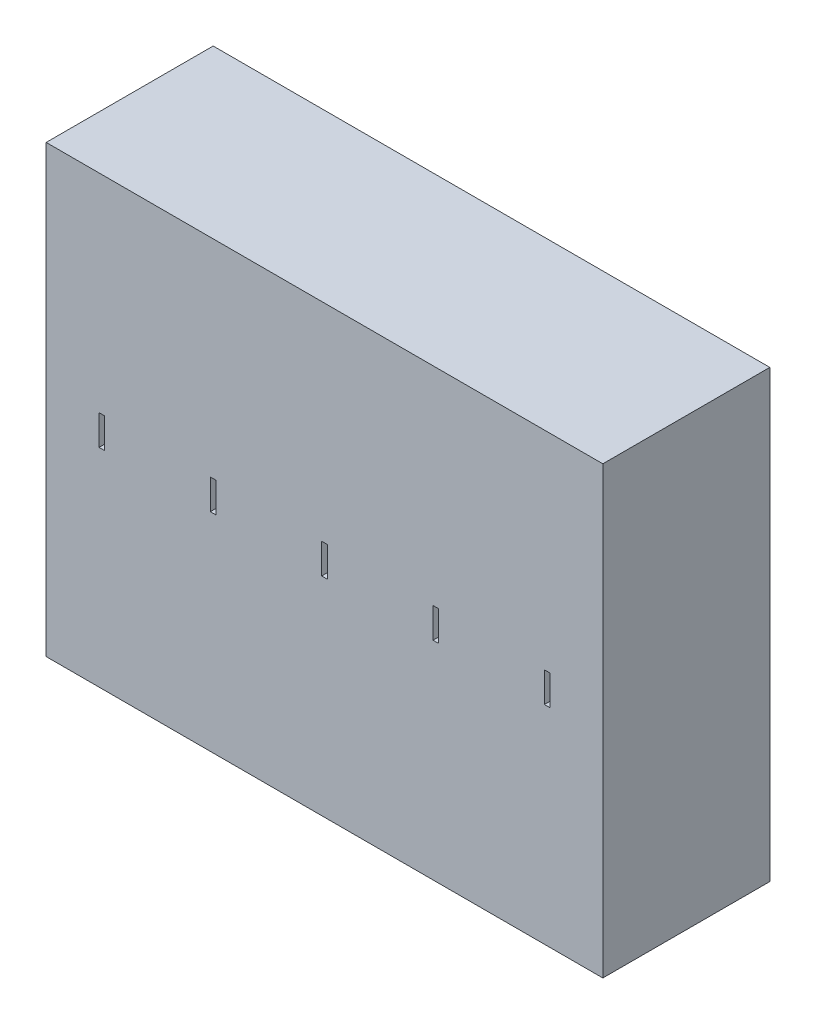
ISO-10303-21;
HEADER;
FILE_DESCRIPTION(('STEP AP214'),'2;1');
FILE_NAME('part.step','',(''),(''),'','','');
FILE_SCHEMA(('AUTOMOTIVE_DESIGN { 1 0 10303 214 1 1 1 1 }'));
ENDSEC;
DATA;
#1=APPLICATION_CONTEXT('core data for automotive mechanical design processes');
#2=APPLICATION_PROTOCOL_DEFINITION('international standard','automotive_design',2000,#1);
#3=PRODUCT_CONTEXT('',#1,'mechanical');
#4=PRODUCT('Part','Part','',(#3));
#5=PRODUCT_RELATED_PRODUCT_CATEGORY('part','',(#4));
#6=PRODUCT_DEFINITION_FORMATION('','',#4);
#7=PRODUCT_DEFINITION_CONTEXT('part definition',#1,'design');
#8=PRODUCT_DEFINITION('design','',#6,#7);
#9=PRODUCT_DEFINITION_SHAPE('','',#8);
#10=(LENGTH_UNIT() NAMED_UNIT(*) SI_UNIT(.MILLI.,.METRE.));
#11=(NAMED_UNIT(*) PLANE_ANGLE_UNIT() SI_UNIT($,.RADIAN.));
#12=(NAMED_UNIT(*) SI_UNIT($,.STERADIAN.) SOLID_ANGLE_UNIT());
#13=UNCERTAINTY_MEASURE_WITH_UNIT(LENGTH_MEASURE(1.E-05),#10,'distance_accuracy_value','');
#14=(GEOMETRIC_REPRESENTATION_CONTEXT(3) GLOBAL_UNCERTAINTY_ASSIGNED_CONTEXT((#13)) GLOBAL_UNIT_ASSIGNED_CONTEXT((#10,
#11,#12)) REPRESENTATION_CONTEXT('',''));
#15=CARTESIAN_POINT('',(0.,0.,0.));
#16=DIRECTION('',(0.,0.,1.));
#17=DIRECTION('',(1.,0.,0.));
#18=AXIS2_PLACEMENT_3D('',#15,#16,#17);
#19=CARTESIAN_POINT('',(2.5,-2.,1.5));
#20=DIRECTION('',(-1.,0.,0.));
#21=DIRECTION('',(0.,0.,1.));
#22=AXIS2_PLACEMENT_3D('',#19,#20,#21);
#23=PLANE('',#22);
#24=DIRECTION('',(0.,1.,0.));
#25=VECTOR('',#24,1.);
#26=CARTESIAN_POINT('',(2.5,-2.,0.));
#27=LINE('',#26,#25);
#28=CARTESIAN_POINT('',(2.5,-2.,0.));
#29=VERTEX_POINT('',#28);
#30=CARTESIAN_POINT('',(2.5,2.,0.));
#31=VERTEX_POINT('',#30);
#32=EDGE_CURVE('E345',#29,#31,#27,.T.);
#33=ORIENTED_EDGE('',*,*,#32,.T.);
#34=DIRECTION('',(0.,0.,-1.));
#35=VECTOR('',#34,1.);
#36=CARTESIAN_POINT('',(2.5,2.,1.5));
#37=LINE('',#36,#35);
#38=CARTESIAN_POINT('',(2.5,2.,1.5));
#39=VERTEX_POINT('',#38);
#40=EDGE_CURVE('E11',#39,#31,#37,.T.);
#41=ORIENTED_EDGE('',*,*,#40,.F.);
#42=DIRECTION('',(0.,1.,0.));
#43=VECTOR('',#42,1.);
#44=CARTESIAN_POINT('',(2.5,-2.,1.5));
#45=LINE('',#44,#43);
#46=CARTESIAN_POINT('',(2.5,-2.,1.5));
#47=VERTEX_POINT('',#46);
#48=EDGE_CURVE('E352',#47,#39,#45,.T.);
#49=ORIENTED_EDGE('',*,*,#48,.F.);
#50=DIRECTION('',(0.,0.,-1.));
#51=VECTOR('',#50,1.);
#52=CARTESIAN_POINT('',(2.5,-2.,1.5));
#53=LINE('',#52,#51);
#54=EDGE_CURVE('E362',#47,#29,#53,.T.);
#55=ORIENTED_EDGE('',*,*,#54,.T.);
#56=EDGE_LOOP('',(#33,#41,#49,#55));
#57=FACE_BOUND('',#56,.T.);
#58=ADVANCED_FACE('F38',(#57),#23,.F.);
#59=CARTESIAN_POINT('',(-2.5,2.,1.5));
#60=DIRECTION('',(0.,-1.,0.));
#61=DIRECTION('',(0.,0.,-1.));
#62=AXIS2_PLACEMENT_3D('',#59,#60,#61);
#63=PLANE('',#62);
#64=DIRECTION('',(-1.,0.,0.));
#65=VECTOR('',#64,1.);
#66=CARTESIAN_POINT('',(-2.5,2.,0.));
#67=LINE('',#66,#65);
#68=CARTESIAN_POINT('',(-2.5,2.,0.));
#69=VERTEX_POINT('',#68);
#70=EDGE_CURVE('E365',#31,#69,#67,.T.);
#71=ORIENTED_EDGE('',*,*,#70,.T.);
#72=DIRECTION('',(0.,0.,-1.));
#73=VECTOR('',#72,1.);
#74=CARTESIAN_POINT('',(-2.5,2.,1.5));
#75=LINE('',#74,#73);
#76=CARTESIAN_POINT('',(-2.5,2.,1.5));
#77=VERTEX_POINT('',#76);
#78=EDGE_CURVE('E45',#77,#69,#75,.T.);
#79=ORIENTED_EDGE('',*,*,#78,.F.);
#80=DIRECTION('',(-1.,0.,0.));
#81=VECTOR('',#80,1.);
#82=CARTESIAN_POINT('',(-2.5,2.,1.5));
#83=LINE('',#82,#81);
#84=EDGE_CURVE('E355',#39,#77,#83,.T.);
#85=ORIENTED_EDGE('',*,*,#84,.F.);
#86=ORIENTED_EDGE('',*,*,#40,.T.);
#87=EDGE_LOOP('',(#71,#79,#85,#86));
#88=FACE_BOUND('',#87,.T.);
#89=ADVANCED_FACE('F395',(#88),#63,.F.);
#90=CARTESIAN_POINT('',(-2.5,-2.,1.5));
#91=DIRECTION('',(1.,0.,0.));
#92=DIRECTION('',(0.,0.,-1.));
#93=AXIS2_PLACEMENT_3D('',#90,#91,#92);
#94=PLANE('',#93);
#95=DIRECTION('',(0.,-1.,0.));
#96=VECTOR('',#95,1.);
#97=CARTESIAN_POINT('',(-2.5,-2.,0.));
#98=LINE('',#97,#96);
#99=CARTESIAN_POINT('',(-2.5,-2.,0.));
#100=VERTEX_POINT('',#99);
#101=EDGE_CURVE('E367',#69,#100,#98,.T.);
#102=ORIENTED_EDGE('',*,*,#101,.T.);
#103=DIRECTION('',(0.,0.,-1.));
#104=VECTOR('',#103,1.);
#105=CARTESIAN_POINT('',(-2.5,-2.,1.5));
#106=LINE('',#105,#104);
#107=CARTESIAN_POINT('',(-2.5,-2.,1.5));
#108=VERTEX_POINT('',#107);
#109=EDGE_CURVE('E372',#108,#100,#106,.T.);
#110=ORIENTED_EDGE('',*,*,#109,.F.);
#111=DIRECTION('',(0.,-1.,0.));
#112=VECTOR('',#111,1.);
#113=CARTESIAN_POINT('',(-2.5,-2.,1.5));
#114=LINE('',#113,#112);
#115=EDGE_CURVE('E358',#77,#108,#114,.T.);
#116=ORIENTED_EDGE('',*,*,#115,.F.);
#117=ORIENTED_EDGE('',*,*,#78,.T.);
#118=EDGE_LOOP('',(#102,#110,#116,#117));
#119=FACE_BOUND('',#118,.T.);
#120=ADVANCED_FACE('F379',(#119),#94,.F.);
#121=CARTESIAN_POINT('',(-2.5,-2.,1.5));
#122=DIRECTION('',(0.,1.,0.));
#123=DIRECTION('',(0.,0.,1.));
#124=AXIS2_PLACEMENT_3D('',#121,#122,#123);
#125=PLANE('',#124);
#126=DIRECTION('',(1.,0.,0.));
#127=VECTOR('',#126,1.);
#128=CARTESIAN_POINT('',(-2.5,-2.,0.));
#129=LINE('',#128,#127);
#130=EDGE_CURVE('E356',#100,#29,#129,.T.);
#131=ORIENTED_EDGE('',*,*,#130,.T.);
#132=ORIENTED_EDGE('',*,*,#54,.F.);
#133=DIRECTION('',(1.,0.,0.));
#134=VECTOR('',#133,1.);
#135=CARTESIAN_POINT('',(-2.5,-2.,1.5));
#136=LINE('',#135,#134);
#137=EDGE_CURVE('E360',#108,#47,#136,.T.);
#138=ORIENTED_EDGE('',*,*,#137,.F.);
#139=ORIENTED_EDGE('',*,*,#109,.T.);
#140=EDGE_LOOP('',(#131,#132,#138,#139));
#141=FACE_BOUND('',#140,.T.);
#142=ADVANCED_FACE('F388',(#141),#125,.F.);
#143=CARTESIAN_POINT('',(0.,0.,1.5));
#144=DIRECTION('',(0.,0.,-1.));
#145=DIRECTION('',(-1.,0.,0.));
#146=AXIS2_PLACEMENT_3D('',#143,#144,#145);
#147=PLANE('',#146);
#148=DIRECTION('',(-1.,0.,0.));
#149=VECTOR('',#148,1.);
#150=CARTESIAN_POINT('',(1.975,0.135,1.5));
#151=LINE('',#150,#149);
#152=CARTESIAN_POINT('',(2.025,0.135,1.5));
#153=VERTEX_POINT('',#152);
#154=CARTESIAN_POINT('',(1.975,0.135,1.5));
#155=VERTEX_POINT('',#154);
#156=EDGE_CURVE('E209',#153,#155,#151,.T.);
#157=ORIENTED_EDGE('',*,*,#156,.F.);
#158=DIRECTION('',(0.,1.,0.));
#159=VECTOR('',#158,1.);
#160=CARTESIAN_POINT('',(2.025,0.135,1.5));
#161=LINE('',#160,#159);
#162=CARTESIAN_POINT('',(2.025,-0.135,1.5));
#163=VERTEX_POINT('',#162);
#164=EDGE_CURVE('E52',#163,#153,#161,.T.);
#165=ORIENTED_EDGE('',*,*,#164,.F.);
#166=DIRECTION('',(1.,0.,0.));
#167=VECTOR('',#166,1.);
#168=CARTESIAN_POINT('',(1.975,-0.135,1.5));
#169=LINE('',#168,#167);
#170=CARTESIAN_POINT('',(1.975,-0.135,1.5));
#171=VERTEX_POINT('',#170);
#172=EDGE_CURVE('E230',#171,#163,#169,.T.);
#173=ORIENTED_EDGE('',*,*,#172,.F.);
#174=DIRECTION('',(0.,-1.,0.));
#175=VECTOR('',#174,1.);
#176=CARTESIAN_POINT('',(1.975,0.135,1.5));
#177=LINE('',#176,#175);
#178=EDGE_CURVE('E221',#155,#171,#177,.T.);
#179=ORIENTED_EDGE('',*,*,#178,.F.);
#180=EDGE_LOOP('',(#157,#165,#173,#179));
#181=FACE_BOUND('',#180,.T.);
#182=DIRECTION('',(-1.,0.,0.));
#183=VECTOR('',#182,1.);
#184=CARTESIAN_POINT('',(0.975,0.135,1.5));
#185=LINE('',#184,#183);
#186=CARTESIAN_POINT('',(1.025,0.135,1.5));
#187=VERTEX_POINT('',#186);
#188=CARTESIAN_POINT('',(0.975,0.135,1.5));
#189=VERTEX_POINT('',#188);
#190=EDGE_CURVE('E235',#187,#189,#185,.T.);
#191=ORIENTED_EDGE('',*,*,#190,.F.);
#192=DIRECTION('',(0.,1.,0.));
#193=VECTOR('',#192,1.);
#194=CARTESIAN_POINT('',(1.025,0.135,1.5));
#195=LINE('',#194,#193);
#196=CARTESIAN_POINT('',(1.025,-0.135,1.5));
#197=VERTEX_POINT('',#196);
#198=EDGE_CURVE('E60',#197,#187,#195,.T.);
#199=ORIENTED_EDGE('',*,*,#198,.F.);
#200=DIRECTION('',(1.,0.,0.));
#201=VECTOR('',#200,1.);
#202=CARTESIAN_POINT('',(0.975,-0.135,1.5));
#203=LINE('',#202,#201);
#204=CARTESIAN_POINT('',(0.975,-0.135,1.5));
#205=VERTEX_POINT('',#204);
#206=EDGE_CURVE('E256',#205,#197,#203,.T.);
#207=ORIENTED_EDGE('',*,*,#206,.F.);
#208=DIRECTION('',(0.,-1.,0.));
#209=VECTOR('',#208,1.);
#210=CARTESIAN_POINT('',(0.975,0.135,1.5));
#211=LINE('',#210,#209);
#212=EDGE_CURVE('E251',#189,#205,#211,.T.);
#213=ORIENTED_EDGE('',*,*,#212,.F.);
#214=EDGE_LOOP('',(#191,#199,#207,#213));
#215=FACE_BOUND('',#214,.T.);
#216=DIRECTION('',(-1.,0.,0.));
#217=VECTOR('',#216,1.);
#218=CARTESIAN_POINT('',(-0.0250000000000003,0.135,1.5));
#219=LINE('',#218,#217);
#220=CARTESIAN_POINT('',(0.0249999999999998,0.135,1.5));
#221=VERTEX_POINT('',#220);
#222=CARTESIAN_POINT('',(-0.0250000000000003,0.135,1.5));
#223=VERTEX_POINT('',#222);
#224=EDGE_CURVE('E261',#221,#223,#219,.T.);
#225=ORIENTED_EDGE('',*,*,#224,.F.);
#226=DIRECTION('',(0.,1.,0.));
#227=VECTOR('',#226,1.);
#228=CARTESIAN_POINT('',(0.0249999999999998,0.135,1.5));
#229=LINE('',#228,#227);
#230=CARTESIAN_POINT('',(0.0249999999999998,-0.135,1.5));
#231=VERTEX_POINT('',#230);
#232=EDGE_CURVE('E288',#231,#221,#229,.T.);
#233=ORIENTED_EDGE('',*,*,#232,.F.);
#234=DIRECTION('',(1.,0.,0.));
#235=VECTOR('',#234,1.);
#236=CARTESIAN_POINT('',(-0.0250000000000003,-0.135,1.5));
#237=LINE('',#236,#235);
#238=CARTESIAN_POINT('',(-0.0250000000000003,-0.135,1.5));
#239=VERTEX_POINT('',#238);
#240=EDGE_CURVE('E283',#239,#231,#237,.T.);
#241=ORIENTED_EDGE('',*,*,#240,.F.);
#242=DIRECTION('',(0.,-1.,0.));
#243=VECTOR('',#242,1.);
#244=CARTESIAN_POINT('',(-0.0250000000000003,0.135,1.5));
#245=LINE('',#244,#243);
#246=EDGE_CURVE('E278',#223,#239,#245,.T.);
#247=ORIENTED_EDGE('',*,*,#246,.F.);
#248=EDGE_LOOP('',(#225,#233,#241,#247));
#249=FACE_BOUND('',#248,.T.);
#250=DIRECTION('',(-1.,0.,0.));
#251=VECTOR('',#250,1.);
#252=CARTESIAN_POINT('',(-1.025,0.135,1.5));
#253=LINE('',#252,#251);
#254=CARTESIAN_POINT('',(-0.975,0.135,1.5));
#255=VERTEX_POINT('',#254);
#256=CARTESIAN_POINT('',(-1.025,0.135,1.5));
#257=VERTEX_POINT('',#256);
#258=EDGE_CURVE('E290',#255,#257,#253,.T.);
#259=ORIENTED_EDGE('',*,*,#258,.F.);
#260=DIRECTION('',(0.,1.,0.));
#261=VECTOR('',#260,1.);
#262=CARTESIAN_POINT('',(-0.975,0.135,1.5));
#263=LINE('',#262,#261);
#264=CARTESIAN_POINT('',(-0.975,-0.135,1.5));
#265=VERTEX_POINT('',#264);
#266=EDGE_CURVE('E317',#265,#255,#263,.T.);
#267=ORIENTED_EDGE('',*,*,#266,.F.);
#268=DIRECTION('',(1.,0.,0.));
#269=VECTOR('',#268,1.);
#270=CARTESIAN_POINT('',(-1.025,-0.135,1.5));
#271=LINE('',#270,#269);
#272=CARTESIAN_POINT('',(-1.025,-0.135,1.5));
#273=VERTEX_POINT('',#272);
#274=EDGE_CURVE('E312',#273,#265,#271,.T.);
#275=ORIENTED_EDGE('',*,*,#274,.F.);
#276=DIRECTION('',(0.,-1.,0.));
#277=VECTOR('',#276,1.);
#278=CARTESIAN_POINT('',(-1.025,0.135,1.5));
#279=LINE('',#278,#277);
#280=EDGE_CURVE('E307',#257,#273,#279,.T.);
#281=ORIENTED_EDGE('',*,*,#280,.F.);
#282=EDGE_LOOP('',(#259,#267,#275,#281));
#283=FACE_BOUND('',#282,.T.);
#284=DIRECTION('',(-1.,0.,0.));
#285=VECTOR('',#284,1.);
#286=CARTESIAN_POINT('',(-2.025,0.135,1.5));
#287=LINE('',#286,#285);
#288=CARTESIAN_POINT('',(-1.975,0.135,1.5));
#289=VERTEX_POINT('',#288);
#290=CARTESIAN_POINT('',(-2.025,0.135,1.5));
#291=VERTEX_POINT('',#290);
#292=EDGE_CURVE('E335',#289,#291,#287,.T.);
#293=ORIENTED_EDGE('',*,*,#292,.F.);
#294=DIRECTION('',(0.,1.,0.));
#295=VECTOR('',#294,1.);
#296=CARTESIAN_POINT('',(-1.975,0.135,1.5));
#297=LINE('',#296,#295);
#298=CARTESIAN_POINT('',(-1.975,-0.135,1.5));
#299=VERTEX_POINT('',#298);
#300=EDGE_CURVE('E319',#299,#289,#297,.T.);
#301=ORIENTED_EDGE('',*,*,#300,.F.);
#302=DIRECTION('',(1.,0.,0.));
#303=VECTOR('',#302,1.);
#304=CARTESIAN_POINT('',(-2.025,-0.135,1.5));
#305=LINE('',#304,#303);
#306=CARTESIAN_POINT('',(-2.025,-0.135,1.5));
#307=VERTEX_POINT('',#306);
#308=EDGE_CURVE('E324',#307,#299,#305,.T.);
#309=ORIENTED_EDGE('',*,*,#308,.F.);
#310=DIRECTION('',(0.,-1.,0.));
#311=VECTOR('',#310,1.);
#312=CARTESIAN_POINT('',(-2.025,0.135,1.5));
#313=LINE('',#312,#311);
#314=EDGE_CURVE('E338',#291,#307,#313,.T.);
#315=ORIENTED_EDGE('',*,*,#314,.F.);
#316=EDGE_LOOP('',(#293,#301,#309,#315));
#317=FACE_BOUND('',#316,.T.);
#318=ORIENTED_EDGE('',*,*,#48,.T.);
#319=ORIENTED_EDGE('',*,*,#84,.T.);
#320=ORIENTED_EDGE('',*,*,#115,.T.);
#321=ORIENTED_EDGE('',*,*,#137,.T.);
#322=EDGE_LOOP('',(#318,#319,#320,#321));
#323=FACE_BOUND('',#322,.T.);
#324=ADVANCED_FACE('F394',(#181,#215,#249,#283,#317,#323),#147,.F.);
#325=CARTESIAN_POINT('',(0.,0.,0.));
#326=DIRECTION('',(0.,0.,-1.));
#327=DIRECTION('',(-1.,0.,0.));
#328=AXIS2_PLACEMENT_3D('',#325,#326,#327);
#329=PLANE('',#328);
#330=ORIENTED_EDGE('',*,*,#32,.F.);
#331=ORIENTED_EDGE('',*,*,#130,.F.);
#332=ORIENTED_EDGE('',*,*,#101,.F.);
#333=ORIENTED_EDGE('',*,*,#70,.F.);
#334=EDGE_LOOP('',(#330,#331,#332,#333));
#335=FACE_BOUND('',#334,.T.);
#336=ADVANCED_FACE('F385',(#335),#329,.T.);
#337=CARTESIAN_POINT('',(-1.975,0.135,1.3));
#338=DIRECTION('',(1.,0.,0.));
#339=DIRECTION('',(0.,0.,-1.));
#340=AXIS2_PLACEMENT_3D('',#337,#338,#339);
#341=PLANE('',#340);
#342=ORIENTED_EDGE('',*,*,#300,.T.);
#343=DIRECTION('',(0.,0.,1.));
#344=VECTOR('',#343,1.);
#345=CARTESIAN_POINT('',(-1.975,0.135,1.3));
#346=LINE('',#345,#344);
#347=CARTESIAN_POINT('',(-1.975,0.135,1.3));
#348=VERTEX_POINT('',#347);
#349=EDGE_CURVE('E333',#348,#289,#346,.T.);
#350=ORIENTED_EDGE('',*,*,#349,.F.);
#351=DIRECTION('',(0.,1.,0.));
#352=VECTOR('',#351,1.);
#353=CARTESIAN_POINT('',(-1.975,0.135,1.3));
#354=LINE('',#353,#352);
#355=CARTESIAN_POINT('',(-1.975,-0.135,1.3));
#356=VERTEX_POINT('',#355);
#357=EDGE_CURVE('E320',#356,#348,#354,.T.);
#358=ORIENTED_EDGE('',*,*,#357,.F.);
#359=DIRECTION('',(0.,0.,1.));
#360=VECTOR('',#359,1.);
#361=CARTESIAN_POINT('',(-1.975,-0.135,1.3));
#362=LINE('',#361,#360);
#363=EDGE_CURVE('E343',#356,#299,#362,.T.);
#364=ORIENTED_EDGE('',*,*,#363,.T.);
#365=EDGE_LOOP('',(#342,#350,#358,#364));
#366=FACE_BOUND('',#365,.T.);
#367=ADVANCED_FACE('F407',(#366),#341,.F.);
#368=CARTESIAN_POINT('',(-2.025,-0.135,1.3));
#369=DIRECTION('',(0.,-1.,0.));
#370=DIRECTION('',(0.,0.,-1.));
#371=AXIS2_PLACEMENT_3D('',#368,#369,#370);
#372=PLANE('',#371);
#373=ORIENTED_EDGE('',*,*,#308,.T.);
#374=ORIENTED_EDGE('',*,*,#363,.F.);
#375=DIRECTION('',(1.,0.,0.));
#376=VECTOR('',#375,1.);
#377=CARTESIAN_POINT('',(-2.025,-0.135,1.3));
#378=LINE('',#377,#376);
#379=CARTESIAN_POINT('',(-2.025,-0.135,1.3));
#380=VERTEX_POINT('',#379);
#381=EDGE_CURVE('E330',#380,#356,#378,.T.);
#382=ORIENTED_EDGE('',*,*,#381,.F.);
#383=DIRECTION('',(0.,0.,1.));
#384=VECTOR('',#383,1.);
#385=CARTESIAN_POINT('',(-2.025,-0.135,1.3));
#386=LINE('',#385,#384);
#387=EDGE_CURVE('E346',#380,#307,#386,.T.);
#388=ORIENTED_EDGE('',*,*,#387,.T.);
#389=EDGE_LOOP('',(#373,#374,#382,#388));
#390=FACE_BOUND('',#389,.T.);
#391=ADVANCED_FACE('F413',(#390),#372,.F.);
#392=CARTESIAN_POINT('',(-2.025,0.135,1.3));
#393=DIRECTION('',(-1.,0.,0.));
#394=DIRECTION('',(0.,0.,1.));
#395=AXIS2_PLACEMENT_3D('',#392,#393,#394);
#396=PLANE('',#395);
#397=ORIENTED_EDGE('',*,*,#314,.T.);
#398=ORIENTED_EDGE('',*,*,#387,.F.);
#399=DIRECTION('',(0.,-1.,0.));
#400=VECTOR('',#399,1.);
#401=CARTESIAN_POINT('',(-2.025,0.135,1.3));
#402=LINE('',#401,#400);
#403=CARTESIAN_POINT('',(-2.025,0.135,1.3));
#404=VERTEX_POINT('',#403);
#405=EDGE_CURVE('E327',#404,#380,#402,.T.);
#406=ORIENTED_EDGE('',*,*,#405,.F.);
#407=DIRECTION('',(0.,0.,1.));
#408=VECTOR('',#407,1.);
#409=CARTESIAN_POINT('',(-2.025,0.135,1.3));
#410=LINE('',#409,#408);
#411=EDGE_CURVE('E348',#404,#291,#410,.T.);
#412=ORIENTED_EDGE('',*,*,#411,.T.);
#413=EDGE_LOOP('',(#397,#398,#406,#412));
#414=FACE_BOUND('',#413,.T.);
#415=ADVANCED_FACE('F419',(#414),#396,.F.);
#416=CARTESIAN_POINT('',(-2.025,0.135,1.3));
#417=DIRECTION('',(0.,1.,0.));
#418=DIRECTION('',(0.,0.,1.));
#419=AXIS2_PLACEMENT_3D('',#416,#417,#418);
#420=PLANE('',#419);
#421=ORIENTED_EDGE('',*,*,#292,.T.);
#422=ORIENTED_EDGE('',*,*,#411,.F.);
#423=DIRECTION('',(-1.,0.,0.));
#424=VECTOR('',#423,1.);
#425=CARTESIAN_POINT('',(-2.025,0.135,1.3));
#426=LINE('',#425,#424);
#427=EDGE_CURVE('E323',#348,#404,#426,.T.);
#428=ORIENTED_EDGE('',*,*,#427,.F.);
#429=ORIENTED_EDGE('',*,*,#349,.T.);
#430=EDGE_LOOP('',(#421,#422,#428,#429));
#431=FACE_BOUND('',#430,.T.);
#432=ADVANCED_FACE('F415',(#431),#420,.F.);
#433=CARTESIAN_POINT('',(0.,0.,1.3));
#434=DIRECTION('',(0.,0.,1.));
#435=DIRECTION('',(1.,0.,0.));
#436=AXIS2_PLACEMENT_3D('',#433,#434,#435);
#437=PLANE('',#436);
#438=ORIENTED_EDGE('',*,*,#357,.T.);
#439=ORIENTED_EDGE('',*,*,#427,.T.);
#440=ORIENTED_EDGE('',*,*,#405,.T.);
#441=ORIENTED_EDGE('',*,*,#381,.T.);
#442=EDGE_LOOP('',(#438,#439,#440,#441));
#443=FACE_BOUND('',#442,.T.);
#444=ADVANCED_FACE('F418',(#443),#437,.T.);
#445=CARTESIAN_POINT('',(-0.975,0.135,1.3));
#446=DIRECTION('',(1.,0.,0.));
#447=DIRECTION('',(0.,0.,-1.));
#448=AXIS2_PLACEMENT_3D('',#445,#446,#447);
#449=PLANE('',#448);
#450=ORIENTED_EDGE('',*,*,#266,.T.);
#451=DIRECTION('',(0.,0.,1.));
#452=VECTOR('',#451,1.);
#453=CARTESIAN_POINT('',(-0.975,0.135,1.3));
#454=LINE('',#453,#452);
#455=CARTESIAN_POINT('',(-0.975,0.135,1.3));
#456=VERTEX_POINT('',#455);
#457=EDGE_CURVE('E304',#456,#255,#454,.T.);
#458=ORIENTED_EDGE('',*,*,#457,.F.);
#459=DIRECTION('',(0.,1.,0.));
#460=VECTOR('',#459,1.);
#461=CARTESIAN_POINT('',(-0.975,0.135,1.3));
#462=LINE('',#461,#460);
#463=CARTESIAN_POINT('',(-0.975,-0.135,1.3));
#464=VERTEX_POINT('',#463);
#465=EDGE_CURVE('E292',#464,#456,#462,.T.);
#466=ORIENTED_EDGE('',*,*,#465,.F.);
#467=DIRECTION('',(0.,0.,1.));
#468=VECTOR('',#467,1.);
#469=CARTESIAN_POINT('',(-0.975,-0.135,1.3));
#470=LINE('',#469,#468);
#471=EDGE_CURVE('E314',#464,#265,#470,.T.);
#472=ORIENTED_EDGE('',*,*,#471,.T.);
#473=EDGE_LOOP('',(#450,#458,#466,#472));
#474=FACE_BOUND('',#473,.T.);
#475=ADVANCED_FACE('F429',(#474),#449,.F.);
#476=CARTESIAN_POINT('',(-1.025,-0.135,1.3));
#477=DIRECTION('',(0.,-1.,0.));
#478=DIRECTION('',(0.,0.,-1.));
#479=AXIS2_PLACEMENT_3D('',#476,#477,#478);
#480=PLANE('',#479);
#481=ORIENTED_EDGE('',*,*,#274,.T.);
#482=ORIENTED_EDGE('',*,*,#471,.F.);
#483=DIRECTION('',(1.,0.,0.));
#484=VECTOR('',#483,1.);
#485=CARTESIAN_POINT('',(-1.025,-0.135,1.3));
#486=LINE('',#485,#484);
#487=CARTESIAN_POINT('',(-1.025,-0.135,1.3));
#488=VERTEX_POINT('',#487);
#489=EDGE_CURVE('E298',#488,#464,#486,.T.);
#490=ORIENTED_EDGE('',*,*,#489,.F.);
#491=DIRECTION('',(0.,0.,1.));
#492=VECTOR('',#491,1.);
#493=CARTESIAN_POINT('',(-1.025,-0.135,1.3));
#494=LINE('',#493,#492);
#495=EDGE_CURVE('E309',#488,#273,#494,.T.);
#496=ORIENTED_EDGE('',*,*,#495,.T.);
#497=EDGE_LOOP('',(#481,#482,#490,#496));
#498=FACE_BOUND('',#497,.T.);
#499=ADVANCED_FACE('F433',(#498),#480,.F.);
#500=CARTESIAN_POINT('',(-1.025,0.135,1.3));
#501=DIRECTION('',(-1.,0.,0.));
#502=DIRECTION('',(0.,0.,1.));
#503=AXIS2_PLACEMENT_3D('',#500,#501,#502);
#504=PLANE('',#503);
#505=ORIENTED_EDGE('',*,*,#280,.T.);
#506=ORIENTED_EDGE('',*,*,#495,.F.);
#507=DIRECTION('',(0.,-1.,0.));
#508=VECTOR('',#507,1.);
#509=CARTESIAN_POINT('',(-1.025,0.135,1.3));
#510=LINE('',#509,#508);
#511=CARTESIAN_POINT('',(-1.025,0.135,1.3));
#512=VERTEX_POINT('',#511);
#513=EDGE_CURVE('E296',#512,#488,#510,.T.);
#514=ORIENTED_EDGE('',*,*,#513,.F.);
#515=DIRECTION('',(0.,0.,1.));
#516=VECTOR('',#515,1.);
#517=CARTESIAN_POINT('',(-1.025,0.135,1.3));
#518=LINE('',#517,#516);
#519=EDGE_CURVE('E301',#512,#257,#518,.T.);
#520=ORIENTED_EDGE('',*,*,#519,.T.);
#521=EDGE_LOOP('',(#505,#506,#514,#520));
#522=FACE_BOUND('',#521,.T.);
#523=ADVANCED_FACE('F437',(#522),#504,.F.);
#524=CARTESIAN_POINT('',(-1.025,0.135,1.3));
#525=DIRECTION('',(0.,1.,0.));
#526=DIRECTION('',(0.,0.,1.));
#527=AXIS2_PLACEMENT_3D('',#524,#525,#526);
#528=PLANE('',#527);
#529=ORIENTED_EDGE('',*,*,#258,.T.);
#530=ORIENTED_EDGE('',*,*,#519,.F.);
#531=DIRECTION('',(-1.,0.,0.));
#532=VECTOR('',#531,1.);
#533=CARTESIAN_POINT('',(-1.025,0.135,1.3));
#534=LINE('',#533,#532);
#535=EDGE_CURVE('E294',#456,#512,#534,.T.);
#536=ORIENTED_EDGE('',*,*,#535,.F.);
#537=ORIENTED_EDGE('',*,*,#457,.T.);
#538=EDGE_LOOP('',(#529,#530,#536,#537));
#539=FACE_BOUND('',#538,.T.);
#540=ADVANCED_FACE('F441',(#539),#528,.F.);
#541=CARTESIAN_POINT('',(1.,0.,1.3));
#542=DIRECTION('',(0.,0.,1.));
#543=DIRECTION('',(1.,0.,0.));
#544=AXIS2_PLACEMENT_3D('',#541,#542,#543);
#545=PLANE('',#544);
#546=ORIENTED_EDGE('',*,*,#465,.T.);
#547=ORIENTED_EDGE('',*,*,#535,.T.);
#548=ORIENTED_EDGE('',*,*,#513,.T.);
#549=ORIENTED_EDGE('',*,*,#489,.T.);
#550=EDGE_LOOP('',(#546,#547,#548,#549));
#551=FACE_BOUND('',#550,.T.);
#552=ADVANCED_FACE('F445',(#551),#545,.T.);
#553=CARTESIAN_POINT('',(0.0249999999999998,0.135,1.3));
#554=DIRECTION('',(1.,0.,0.));
#555=DIRECTION('',(0.,0.,-1.));
#556=AXIS2_PLACEMENT_3D('',#553,#554,#555);
#557=PLANE('',#556);
#558=ORIENTED_EDGE('',*,*,#232,.T.);
#559=DIRECTION('',(0.,0.,1.));
#560=VECTOR('',#559,1.);
#561=CARTESIAN_POINT('',(0.0249999999999998,0.135,1.3));
#562=LINE('',#561,#560);
#563=CARTESIAN_POINT('',(0.0249999999999998,0.135,1.3));
#564=VERTEX_POINT('',#563);
#565=EDGE_CURVE('E275',#564,#221,#562,.T.);
#566=ORIENTED_EDGE('',*,*,#565,.F.);
#567=DIRECTION('',(0.,1.,0.));
#568=VECTOR('',#567,1.);
#569=CARTESIAN_POINT('',(0.0249999999999998,0.135,1.3));
#570=LINE('',#569,#568);
#571=CARTESIAN_POINT('',(0.0249999999999998,-0.135,1.3));
#572=VERTEX_POINT('',#571);
#573=EDGE_CURVE('E263',#572,#564,#570,.T.);
#574=ORIENTED_EDGE('',*,*,#573,.F.);
#575=DIRECTION('',(0.,0.,1.));
#576=VECTOR('',#575,1.);
#577=CARTESIAN_POINT('',(0.0249999999999998,-0.135,1.3));
#578=LINE('',#577,#576);
#579=EDGE_CURVE('E285',#572,#231,#578,.T.);
#580=ORIENTED_EDGE('',*,*,#579,.T.);
#581=EDGE_LOOP('',(#558,#566,#574,#580));
#582=FACE_BOUND('',#581,.T.);
#583=ADVANCED_FACE('F449',(#582),#557,.F.);
#584=CARTESIAN_POINT('',(-0.0250000000000003,-0.135,1.3));
#585=DIRECTION('',(0.,-1.,0.));
#586=DIRECTION('',(0.,0.,-1.));
#587=AXIS2_PLACEMENT_3D('',#584,#585,#586);
#588=PLANE('',#587);
#589=ORIENTED_EDGE('',*,*,#240,.T.);
#590=ORIENTED_EDGE('',*,*,#579,.F.);
#591=DIRECTION('',(1.,0.,0.));
#592=VECTOR('',#591,1.);
#593=CARTESIAN_POINT('',(-0.0250000000000003,-0.135,1.3));
#594=LINE('',#593,#592);
#595=CARTESIAN_POINT('',(-0.0250000000000003,-0.135,1.3));
#596=VERTEX_POINT('',#595);
#597=EDGE_CURVE('E269',#596,#572,#594,.T.);
#598=ORIENTED_EDGE('',*,*,#597,.F.);
#599=DIRECTION('',(0.,0.,1.));
#600=VECTOR('',#599,1.);
#601=CARTESIAN_POINT('',(-0.0250000000000003,-0.135,1.3));
#602=LINE('',#601,#600);
#603=EDGE_CURVE('E280',#596,#239,#602,.T.);
#604=ORIENTED_EDGE('',*,*,#603,.T.);
#605=EDGE_LOOP('',(#589,#590,#598,#604));
#606=FACE_BOUND('',#605,.T.);
#607=ADVANCED_FACE('F453',(#606),#588,.F.);
#608=CARTESIAN_POINT('',(-0.0250000000000003,0.135,1.3));
#609=DIRECTION('',(-1.,0.,0.));
#610=DIRECTION('',(0.,0.,1.));
#611=AXIS2_PLACEMENT_3D('',#608,#609,#610);
#612=PLANE('',#611);
#613=ORIENTED_EDGE('',*,*,#246,.T.);
#614=ORIENTED_EDGE('',*,*,#603,.F.);
#615=DIRECTION('',(0.,-1.,0.));
#616=VECTOR('',#615,1.);
#617=CARTESIAN_POINT('',(-0.0250000000000003,0.135,1.3));
#618=LINE('',#617,#616);
#619=CARTESIAN_POINT('',(-0.0250000000000003,0.135,1.3));
#620=VERTEX_POINT('',#619);
#621=EDGE_CURVE('E267',#620,#596,#618,.T.);
#622=ORIENTED_EDGE('',*,*,#621,.F.);
#623=DIRECTION('',(0.,0.,1.));
#624=VECTOR('',#623,1.);
#625=CARTESIAN_POINT('',(-0.0250000000000003,0.135,1.3));
#626=LINE('',#625,#624);
#627=EDGE_CURVE('E272',#620,#223,#626,.T.);
#628=ORIENTED_EDGE('',*,*,#627,.T.);
#629=EDGE_LOOP('',(#613,#614,#622,#628));
#630=FACE_BOUND('',#629,.T.);
#631=ADVANCED_FACE('F457',(#630),#612,.F.);
#632=CARTESIAN_POINT('',(-0.0250000000000003,0.135,1.3));
#633=DIRECTION('',(0.,1.,0.));
#634=DIRECTION('',(0.,0.,1.));
#635=AXIS2_PLACEMENT_3D('',#632,#633,#634);
#636=PLANE('',#635);
#637=ORIENTED_EDGE('',*,*,#224,.T.);
#638=ORIENTED_EDGE('',*,*,#627,.F.);
#639=DIRECTION('',(-1.,0.,0.));
#640=VECTOR('',#639,1.);
#641=CARTESIAN_POINT('',(-0.0250000000000003,0.135,1.3));
#642=LINE('',#641,#640);
#643=EDGE_CURVE('E265',#564,#620,#642,.T.);
#644=ORIENTED_EDGE('',*,*,#643,.F.);
#645=ORIENTED_EDGE('',*,*,#565,.T.);
#646=EDGE_LOOP('',(#637,#638,#644,#645));
#647=FACE_BOUND('',#646,.T.);
#648=ADVANCED_FACE('F461',(#647),#636,.F.);
#649=CARTESIAN_POINT('',(2.,0.,1.3));
#650=DIRECTION('',(0.,0.,1.));
#651=DIRECTION('',(1.,0.,0.));
#652=AXIS2_PLACEMENT_3D('',#649,#650,#651);
#653=PLANE('',#652);
#654=ORIENTED_EDGE('',*,*,#573,.T.);
#655=ORIENTED_EDGE('',*,*,#643,.T.);
#656=ORIENTED_EDGE('',*,*,#621,.T.);
#657=ORIENTED_EDGE('',*,*,#597,.T.);
#658=EDGE_LOOP('',(#654,#655,#656,#657));
#659=FACE_BOUND('',#658,.T.);
#660=ADVANCED_FACE('F465',(#659),#653,.T.);
#661=CARTESIAN_POINT('',(1.025,0.135,1.3));
#662=DIRECTION('',(1.,0.,0.));
#663=DIRECTION('',(0.,0.,-1.));
#664=AXIS2_PLACEMENT_3D('',#661,#662,#663);
#665=PLANE('',#664);
#666=ORIENTED_EDGE('',*,*,#198,.T.);
#667=DIRECTION('',(0.,0.,1.));
#668=VECTOR('',#667,1.);
#669=CARTESIAN_POINT('',(1.025,0.135,1.3));
#670=LINE('',#669,#668);
#671=CARTESIAN_POINT('',(1.025,0.135,1.3));
#672=VERTEX_POINT('',#671);
#673=EDGE_CURVE('E249',#672,#187,#670,.T.);
#674=ORIENTED_EDGE('',*,*,#673,.F.);
#675=DIRECTION('',(0.,1.,0.));
#676=VECTOR('',#675,1.);
#677=CARTESIAN_POINT('',(1.025,0.135,1.3));
#678=LINE('',#677,#676);
#679=CARTESIAN_POINT('',(1.025,-0.135,1.3));
#680=VERTEX_POINT('',#679);
#681=EDGE_CURVE('E237',#680,#672,#678,.T.);
#682=ORIENTED_EDGE('',*,*,#681,.F.);
#683=DIRECTION('',(0.,0.,1.));
#684=VECTOR('',#683,1.);
#685=CARTESIAN_POINT('',(1.025,-0.135,1.3));
#686=LINE('',#685,#684);
#687=EDGE_CURVE('E258',#680,#197,#686,.T.);
#688=ORIENTED_EDGE('',*,*,#687,.T.);
#689=EDGE_LOOP('',(#666,#674,#682,#688));
#690=FACE_BOUND('',#689,.T.);
#691=ADVANCED_FACE('F469',(#690),#665,.F.);
#692=CARTESIAN_POINT('',(0.975,-0.135,1.3));
#693=DIRECTION('',(0.,-1.,0.));
#694=DIRECTION('',(0.,0.,-1.));
#695=AXIS2_PLACEMENT_3D('',#692,#693,#694);
#696=PLANE('',#695);
#697=ORIENTED_EDGE('',*,*,#206,.T.);
#698=ORIENTED_EDGE('',*,*,#687,.F.);
#699=DIRECTION('',(1.,0.,0.));
#700=VECTOR('',#699,1.);
#701=CARTESIAN_POINT('',(0.975,-0.135,1.3));
#702=LINE('',#701,#700);
#703=CARTESIAN_POINT('',(0.975,-0.135,1.3));
#704=VERTEX_POINT('',#703);
#705=EDGE_CURVE('E243',#704,#680,#702,.T.);
#706=ORIENTED_EDGE('',*,*,#705,.F.);
#707=DIRECTION('',(0.,0.,1.));
#708=VECTOR('',#707,1.);
#709=CARTESIAN_POINT('',(0.975,-0.135,1.3));
#710=LINE('',#709,#708);
#711=EDGE_CURVE('E253',#704,#205,#710,.T.);
#712=ORIENTED_EDGE('',*,*,#711,.T.);
#713=EDGE_LOOP('',(#697,#698,#706,#712));
#714=FACE_BOUND('',#713,.T.);
#715=ADVANCED_FACE('F473',(#714),#696,.F.);
#716=CARTESIAN_POINT('',(0.975,0.135,1.3));
#717=DIRECTION('',(-1.,0.,0.));
#718=DIRECTION('',(0.,0.,1.));
#719=AXIS2_PLACEMENT_3D('',#716,#717,#718);
#720=PLANE('',#719);
#721=ORIENTED_EDGE('',*,*,#212,.T.);
#722=ORIENTED_EDGE('',*,*,#711,.F.);
#723=DIRECTION('',(0.,-1.,0.));
#724=VECTOR('',#723,1.);
#725=CARTESIAN_POINT('',(0.975,0.135,1.3));
#726=LINE('',#725,#724);
#727=CARTESIAN_POINT('',(0.975,0.135,1.3));
#728=VERTEX_POINT('',#727);
#729=EDGE_CURVE('E241',#728,#704,#726,.T.);
#730=ORIENTED_EDGE('',*,*,#729,.F.);
#731=DIRECTION('',(0.,0.,1.));
#732=VECTOR('',#731,1.);
#733=CARTESIAN_POINT('',(0.975,0.135,1.3));
#734=LINE('',#733,#732);
#735=EDGE_CURVE('E246',#728,#189,#734,.T.);
#736=ORIENTED_EDGE('',*,*,#735,.T.);
#737=EDGE_LOOP('',(#721,#722,#730,#736));
#738=FACE_BOUND('',#737,.T.);
#739=ADVANCED_FACE('F476',(#738),#720,.F.);
#740=CARTESIAN_POINT('',(0.975,0.135,1.3));
#741=DIRECTION('',(0.,1.,0.));
#742=DIRECTION('',(0.,0.,1.));
#743=AXIS2_PLACEMENT_3D('',#740,#741,#742);
#744=PLANE('',#743);
#745=ORIENTED_EDGE('',*,*,#190,.T.);
#746=ORIENTED_EDGE('',*,*,#735,.F.);
#747=DIRECTION('',(-1.,0.,0.));
#748=VECTOR('',#747,1.);
#749=CARTESIAN_POINT('',(0.975,0.135,1.3));
#750=LINE('',#749,#748);
#751=EDGE_CURVE('E239',#672,#728,#750,.T.);
#752=ORIENTED_EDGE('',*,*,#751,.F.);
#753=ORIENTED_EDGE('',*,*,#673,.T.);
#754=EDGE_LOOP('',(#745,#746,#752,#753));
#755=FACE_BOUND('',#754,.T.);
#756=ADVANCED_FACE('F480',(#755),#744,.F.);
#757=CARTESIAN_POINT('',(3.,0.,1.3));
#758=DIRECTION('',(0.,0.,1.));
#759=DIRECTION('',(1.,0.,0.));
#760=AXIS2_PLACEMENT_3D('',#757,#758,#759);
#761=PLANE('',#760);
#762=ORIENTED_EDGE('',*,*,#681,.T.);
#763=ORIENTED_EDGE('',*,*,#751,.T.);
#764=ORIENTED_EDGE('',*,*,#729,.T.);
#765=ORIENTED_EDGE('',*,*,#705,.T.);
#766=EDGE_LOOP('',(#762,#763,#764,#765));
#767=FACE_BOUND('',#766,.T.);
#768=ADVANCED_FACE('F484',(#767),#761,.T.);
#769=CARTESIAN_POINT('',(2.025,0.135,1.3));
#770=DIRECTION('',(1.,0.,0.));
#771=DIRECTION('',(0.,0.,-1.));
#772=AXIS2_PLACEMENT_3D('',#769,#770,#771);
#773=PLANE('',#772);
#774=ORIENTED_EDGE('',*,*,#164,.T.);
#775=DIRECTION('',(0.,0.,1.));
#776=VECTOR('',#775,1.);
#777=CARTESIAN_POINT('',(2.025,0.135,1.3));
#778=LINE('',#777,#776);
#779=CARTESIAN_POINT('',(2.025,0.135,1.3));
#780=VERTEX_POINT('',#779);
#781=EDGE_CURVE('E214',#780,#153,#778,.T.);
#782=ORIENTED_EDGE('',*,*,#781,.F.);
#783=DIRECTION('',(0.,1.,0.));
#784=VECTOR('',#783,1.);
#785=CARTESIAN_POINT('',(2.025,0.135,1.3));
#786=LINE('',#785,#784);
#787=CARTESIAN_POINT('',(2.025,-0.135,1.3));
#788=VERTEX_POINT('',#787);
#789=EDGE_CURVE('E201',#788,#780,#786,.T.);
#790=ORIENTED_EDGE('',*,*,#789,.F.);
#791=DIRECTION('',(0.,0.,1.));
#792=VECTOR('',#791,1.);
#793=CARTESIAN_POINT('',(2.025,-0.135,1.3));
#794=LINE('',#793,#792);
#795=EDGE_CURVE('E232',#788,#163,#794,.T.);
#796=ORIENTED_EDGE('',*,*,#795,.T.);
#797=EDGE_LOOP('',(#774,#782,#790,#796));
#798=FACE_BOUND('',#797,.T.);
#799=ADVANCED_FACE('F220',(#798),#773,.F.);
#800=CARTESIAN_POINT('',(1.975,-0.135,1.3));
#801=DIRECTION('',(0.,-1.,0.));
#802=DIRECTION('',(0.,0.,-1.));
#803=AXIS2_PLACEMENT_3D('',#800,#801,#802);
#804=PLANE('',#803);
#805=ORIENTED_EDGE('',*,*,#172,.T.);
#806=ORIENTED_EDGE('',*,*,#795,.F.);
#807=DIRECTION('',(1.,0.,0.));
#808=VECTOR('',#807,1.);
#809=CARTESIAN_POINT('',(1.975,-0.135,1.3));
#810=LINE('',#809,#808);
#811=CARTESIAN_POINT('',(1.975,-0.135,1.3));
#812=VERTEX_POINT('',#811);
#813=EDGE_CURVE('E207',#812,#788,#810,.T.);
#814=ORIENTED_EDGE('',*,*,#813,.F.);
#815=DIRECTION('',(0.,0.,1.));
#816=VECTOR('',#815,1.);
#817=CARTESIAN_POINT('',(1.975,-0.135,1.3));
#818=LINE('',#817,#816);
#819=EDGE_CURVE('E223',#812,#171,#818,.T.);
#820=ORIENTED_EDGE('',*,*,#819,.T.);
#821=EDGE_LOOP('',(#805,#806,#814,#820));
#822=FACE_BOUND('',#821,.T.);
#823=ADVANCED_FACE('F491',(#822),#804,.F.);
#824=CARTESIAN_POINT('',(1.975,0.135,1.3));
#825=DIRECTION('',(-1.,0.,0.));
#826=DIRECTION('',(0.,0.,1.));
#827=AXIS2_PLACEMENT_3D('',#824,#825,#826);
#828=PLANE('',#827);
#829=ORIENTED_EDGE('',*,*,#178,.T.);
#830=ORIENTED_EDGE('',*,*,#819,.F.);
#831=DIRECTION('',(0.,-1.,0.));
#832=VECTOR('',#831,1.);
#833=CARTESIAN_POINT('',(1.975,0.135,1.3));
#834=LINE('',#833,#832);
#835=CARTESIAN_POINT('',(1.975,0.135,1.3));
#836=VERTEX_POINT('',#835);
#837=EDGE_CURVE('E218',#836,#812,#834,.T.);
#838=ORIENTED_EDGE('',*,*,#837,.F.);
#839=DIRECTION('',(0.,0.,1.));
#840=VECTOR('',#839,1.);
#841=CARTESIAN_POINT('',(1.975,0.135,1.3));
#842=LINE('',#841,#840);
#843=EDGE_CURVE('E217',#836,#155,#842,.T.);
#844=ORIENTED_EDGE('',*,*,#843,.T.);
#845=EDGE_LOOP('',(#829,#830,#838,#844));
#846=FACE_BOUND('',#845,.T.);
#847=ADVANCED_FACE('F494',(#846),#828,.F.);
#848=CARTESIAN_POINT('',(1.975,0.135,1.3));
#849=DIRECTION('',(0.,1.,0.));
#850=DIRECTION('',(0.,0.,1.));
#851=AXIS2_PLACEMENT_3D('',#848,#849,#850);
#852=PLANE('',#851);
#853=ORIENTED_EDGE('',*,*,#156,.T.);
#854=ORIENTED_EDGE('',*,*,#843,.F.);
#855=DIRECTION('',(-1.,0.,0.));
#856=VECTOR('',#855,1.);
#857=CARTESIAN_POINT('',(1.975,0.135,1.3));
#858=LINE('',#857,#856);
#859=EDGE_CURVE('E204',#780,#836,#858,.T.);
#860=ORIENTED_EDGE('',*,*,#859,.F.);
#861=ORIENTED_EDGE('',*,*,#781,.T.);
#862=EDGE_LOOP('',(#853,#854,#860,#861));
#863=FACE_BOUND('',#862,.T.);
#864=ADVANCED_FACE('F213',(#863),#852,.F.);
#865=CARTESIAN_POINT('',(4.,0.,1.3));
#866=DIRECTION('',(0.,0.,1.));
#867=DIRECTION('',(1.,0.,0.));
#868=AXIS2_PLACEMENT_3D('',#865,#866,#867);
#869=PLANE('',#868);
#870=ORIENTED_EDGE('',*,*,#789,.T.);
#871=ORIENTED_EDGE('',*,*,#859,.T.);
#872=ORIENTED_EDGE('',*,*,#837,.T.);
#873=ORIENTED_EDGE('',*,*,#813,.T.);
#874=EDGE_LOOP('',(#870,#871,#872,#873));
#875=FACE_BOUND('',#874,.T.);
#876=ADVANCED_FACE('F203',(#875),#869,.T.);
#877=CLOSED_SHELL('',(#58,#89,#120,#142,#324,#336,#367,#391,#415,#432,#444,#475,#499,#523,#540,
#552,#583,#607,#631,#648,#660,#691,#715,#739,#756,#768,#799,#823,#847,#864,#876));
#878=MANIFOLD_SOLID_BREP('B2',#877);
#879=ADVANCED_BREP_SHAPE_REPRESENTATION('',(#18,#878),#14);
#880=SHAPE_DEFINITION_REPRESENTATION(#9,#879);
ENDSEC;
END-ISO-10303-21;
